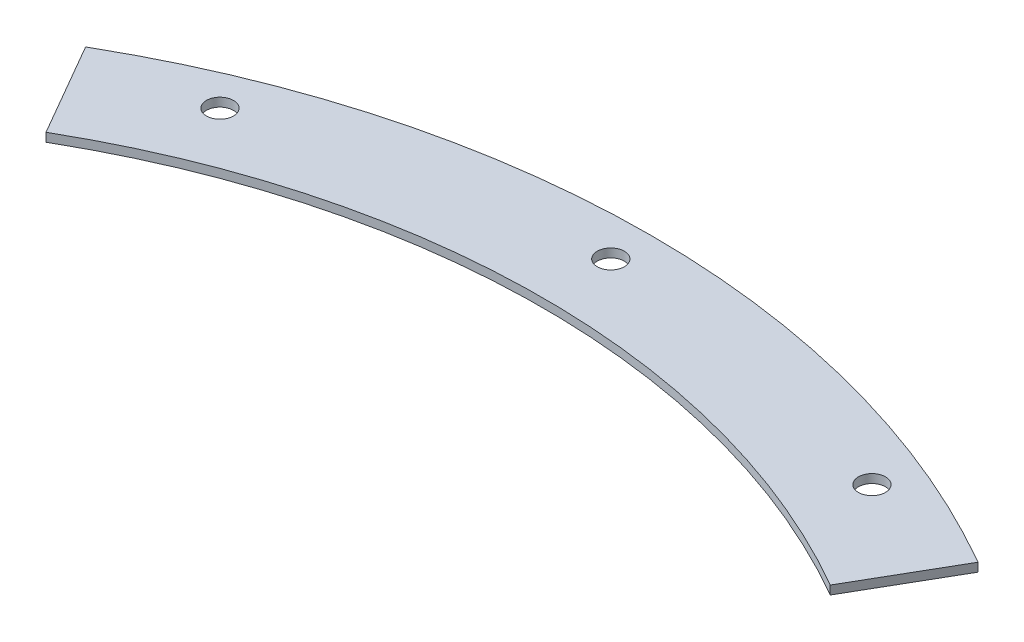
ISO-10303-21;
HEADER;
FILE_DESCRIPTION(('STEP AP214'),'2;1');
FILE_NAME('part.step','',(''),(''),'','','');
FILE_SCHEMA(('AUTOMOTIVE_DESIGN { 1 0 10303 214 1 1 1 1 }'));
ENDSEC;
DATA;
#1=APPLICATION_CONTEXT('core data for automotive mechanical design processes');
#2=APPLICATION_PROTOCOL_DEFINITION('international standard','automotive_design',2000,#1);
#3=PRODUCT_CONTEXT('',#1,'mechanical');
#4=PRODUCT('Part','Part','',(#3));
#5=PRODUCT_RELATED_PRODUCT_CATEGORY('part','',(#4));
#6=PRODUCT_DEFINITION_FORMATION('','',#4);
#7=PRODUCT_DEFINITION_CONTEXT('part definition',#1,'design');
#8=PRODUCT_DEFINITION('design','',#6,#7);
#9=PRODUCT_DEFINITION_SHAPE('','',#8);
#10=(LENGTH_UNIT() NAMED_UNIT(*) SI_UNIT(.MILLI.,.METRE.));
#11=(NAMED_UNIT(*) PLANE_ANGLE_UNIT() SI_UNIT($,.RADIAN.));
#12=(NAMED_UNIT(*) SI_UNIT($,.STERADIAN.) SOLID_ANGLE_UNIT());
#13=UNCERTAINTY_MEASURE_WITH_UNIT(LENGTH_MEASURE(1.E-05),#10,'distance_accuracy_value','');
#14=(GEOMETRIC_REPRESENTATION_CONTEXT(3) GLOBAL_UNCERTAINTY_ASSIGNED_CONTEXT((#13)) GLOBAL_UNIT_ASSIGNED_CONTEXT((#10,
#11,#12)) REPRESENTATION_CONTEXT('',''));
#15=CARTESIAN_POINT('',(0.,0.,0.));
#16=DIRECTION('',(0.,0.,1.));
#17=DIRECTION('',(1.,0.,0.));
#18=AXIS2_PLACEMENT_3D('',#15,#16,#17);
#19=CARTESIAN_POINT('',(0.,1.6,0.));
#20=DIRECTION('',(0.,-1.,0.));
#21=DIRECTION('',(0.,0.,-1.));
#22=AXIS2_PLACEMENT_3D('',#19,#20,#21);
#23=CYLINDRICAL_SURFACE('',#22,145.0000021);
#24=CARTESIAN_POINT('',(0.,0.,0.));
#25=DIRECTION('',(0.,-1.,0.));
#26=DIRECTION('',(0.,0.,-1.));
#27=AXIS2_PLACEMENT_3D('',#24,#25,#26);
#28=CIRCLE('',#27,145.0000021);
#29=CARTESIAN_POINT('',(-72.5000010500002,0.,-125.573685367397));
#30=VERTEX_POINT('',#29);
#31=CARTESIAN_POINT('',(72.5000010500002,0.,-125.573685367397));
#32=VERTEX_POINT('',#31);
#33=EDGE_CURVE('E96',#30,#32,#28,.T.);
#34=ORIENTED_EDGE('',*,*,#33,.T.);
#35=DIRECTION('',(0.,-1.,0.));
#36=VECTOR('',#35,1.);
#37=CARTESIAN_POINT('',(72.5000010500002,1.6,-125.573685367397));
#38=LINE('',#37,#36);
#39=CARTESIAN_POINT('',(72.5000010500002,1.6,-125.573685367397));
#40=VERTEX_POINT('',#39);
#41=EDGE_CURVE('E11',#40,#32,#38,.T.);
#42=ORIENTED_EDGE('',*,*,#41,.F.);
#43=CARTESIAN_POINT('',(0.,1.6,0.));
#44=DIRECTION('',(0.,-1.,0.));
#45=DIRECTION('',(0.,0.,-1.));
#46=AXIS2_PLACEMENT_3D('',#43,#44,#45);
#47=CIRCLE('',#46,145.0000021);
#48=CARTESIAN_POINT('',(-72.5000010500002,1.6,-125.573685367397));
#49=VERTEX_POINT('',#48);
#50=EDGE_CURVE('E84',#49,#40,#47,.T.);
#51=ORIENTED_EDGE('',*,*,#50,.F.);
#52=DIRECTION('',(0.,-1.,0.));
#53=VECTOR('',#52,1.);
#54=CARTESIAN_POINT('',(-72.5000010500002,1.6,-125.573685367397));
#55=LINE('',#54,#53);
#56=EDGE_CURVE('E92',#49,#30,#55,.T.);
#57=ORIENTED_EDGE('',*,*,#56,.T.);
#58=EDGE_LOOP('',(#34,#42,#51,#57));
#59=FACE_BOUND('',#58,.T.);
#60=ADVANCED_FACE('F33',(#59),#23,.F.);
#61=CARTESIAN_POINT('',(72.5000010500002,1.6,-125.573685367397));
#62=DIRECTION('',(-0.866025403784437,0.,-0.500000000000003));
#63=DIRECTION('',(-0.500000000000003,0.,0.866025403784437));
#64=AXIS2_PLACEMENT_3D('',#61,#62,#63);
#65=PLANE('',#64);
#66=DIRECTION('',(0.500000000000003,0.,-0.866025403784437));
#67=VECTOR('',#66,1.);
#68=CARTESIAN_POINT('',(72.5000010500002,0.,-125.573685367397));
#69=LINE('',#68,#67);
#70=CARTESIAN_POINT('',(82.5000010500002,0.,-142.894193443086));
#71=VERTEX_POINT('',#70);
#72=EDGE_CURVE('E88',#32,#71,#69,.T.);
#73=ORIENTED_EDGE('',*,*,#72,.T.);
#74=DIRECTION('',(0.,-1.,0.));
#75=VECTOR('',#74,1.);
#76=CARTESIAN_POINT('',(82.5000010500002,1.6,-142.894193443086));
#77=LINE('',#76,#75);
#78=CARTESIAN_POINT('',(82.5000010500002,1.6,-142.894193443086));
#79=VERTEX_POINT('',#78);
#80=EDGE_CURVE('E41',#79,#71,#77,.T.);
#81=ORIENTED_EDGE('',*,*,#80,.F.);
#82=DIRECTION('',(0.500000000000003,0.,-0.866025403784437));
#83=VECTOR('',#82,1.);
#84=CARTESIAN_POINT('',(72.5000010500002,1.6,-125.573685367397));
#85=LINE('',#84,#83);
#86=EDGE_CURVE('E79',#40,#79,#85,.T.);
#87=ORIENTED_EDGE('',*,*,#86,.F.);
#88=ORIENTED_EDGE('',*,*,#41,.T.);
#89=EDGE_LOOP('',(#73,#81,#87,#88));
#90=FACE_BOUND('',#89,.T.);
#91=ADVANCED_FACE('F87',(#90),#65,.F.);
#92=CARTESIAN_POINT('',(0.,1.6,0.));
#93=DIRECTION('',(0.,-1.,0.));
#94=DIRECTION('',(0.,0.,-1.));
#95=AXIS2_PLACEMENT_3D('',#92,#93,#94);
#96=CYLINDRICAL_SURFACE('',#95,165.0000021);
#97=CARTESIAN_POINT('',(0.,0.,0.));
#98=DIRECTION('',(0.,1.,0.));
#99=DIRECTION('',(0.,0.,-1.));
#100=AXIS2_PLACEMENT_3D('',#97,#98,#99);
#101=CIRCLE('',#100,165.0000021);
#102=CARTESIAN_POINT('',(-82.5000010500002,0.,-142.894193443086));
#103=VERTEX_POINT('',#102);
#104=EDGE_CURVE('E66',#71,#103,#101,.T.);
#105=ORIENTED_EDGE('',*,*,#104,.T.);
#106=DIRECTION('',(0.,-1.,0.));
#107=VECTOR('',#106,1.);
#108=CARTESIAN_POINT('',(-82.5000010500002,1.6,-142.894193443086));
#109=LINE('',#108,#107);
#110=CARTESIAN_POINT('',(-82.5000010500002,1.6,-142.894193443086));
#111=VERTEX_POINT('',#110);
#112=EDGE_CURVE('E89',#111,#103,#109,.T.);
#113=ORIENTED_EDGE('',*,*,#112,.F.);
#114=CARTESIAN_POINT('',(0.,1.6,0.));
#115=DIRECTION('',(0.,1.,0.));
#116=DIRECTION('',(0.,0.,-1.));
#117=AXIS2_PLACEMENT_3D('',#114,#115,#116);
#118=CIRCLE('',#117,165.0000021);
#119=EDGE_CURVE('E82',#79,#111,#118,.T.);
#120=ORIENTED_EDGE('',*,*,#119,.F.);
#121=ORIENTED_EDGE('',*,*,#80,.T.);
#122=EDGE_LOOP('',(#105,#113,#120,#121));
#123=FACE_BOUND('',#122,.T.);
#124=ADVANCED_FACE('F90',(#123),#96,.T.);
#125=CARTESIAN_POINT('',(-72.5000010500002,1.6,-125.573685367397));
#126=DIRECTION('',(0.866025403784437,0.,-0.500000000000003));
#127=DIRECTION('',(-0.500000000000003,0.,-0.866025403784437));
#128=AXIS2_PLACEMENT_3D('',#125,#126,#127);
#129=PLANE('',#128);
#130=DIRECTION('',(0.500000000000003,0.,0.866025403784437));
#131=VECTOR('',#130,1.);
#132=CARTESIAN_POINT('',(-72.5000010500002,0.,-125.573685367397));
#133=LINE('',#132,#131);
#134=EDGE_CURVE('E72',#103,#30,#133,.T.);
#135=ORIENTED_EDGE('',*,*,#134,.T.);
#136=ORIENTED_EDGE('',*,*,#56,.F.);
#137=DIRECTION('',(0.500000000000003,0.,0.866025403784437));
#138=VECTOR('',#137,1.);
#139=CARTESIAN_POINT('',(-72.5000010500002,1.6,-125.573685367397));
#140=LINE('',#139,#138);
#141=EDGE_CURVE('E49',#111,#49,#140,.T.);
#142=ORIENTED_EDGE('',*,*,#141,.F.);
#143=ORIENTED_EDGE('',*,*,#112,.T.);
#144=EDGE_LOOP('',(#135,#136,#142,#143));
#145=FACE_BOUND('',#144,.T.);
#146=ADVANCED_FACE('F104',(#145),#129,.F.);
#147=CARTESIAN_POINT('',(0.,1.6,0.));
#148=DIRECTION('',(0.,-1.,0.));
#149=DIRECTION('',(0.,0.,-1.));
#150=AXIS2_PLACEMENT_3D('',#147,#148,#149);
#151=PLANE('',#150);
#152=CARTESIAN_POINT('',(0.,1.6,-157.5));
#153=DIRECTION('',(0.,-1.,0.));
#154=DIRECTION('',(0.,0.,-1.));
#155=AXIS2_PLACEMENT_3D('',#152,#153,#154);
#156=CIRCLE('',#155,2.5);
#157=CARTESIAN_POINT('',(0.,1.6,-160.));
#158=VERTEX_POINT('',#157);
#159=EDGE_CURVE('E115',#158,#158,#156,.T.);
#160=ORIENTED_EDGE('',*,*,#159,.T.);
#161=EDGE_LOOP('',(#160));
#162=FACE_BOUND('',#161,.T.);
#163=CARTESIAN_POINT('',(60.2726405975008,1.6,-145.511026370528));
#164=DIRECTION('',(0.,-1.,0.));
#165=DIRECTION('',(0.,0.,-1.));
#166=AXIS2_PLACEMENT_3D('',#163,#164,#165);
#167=CIRCLE('',#166,2.5);
#168=CARTESIAN_POINT('',(60.2726405975008,1.6,-148.011026370528));
#169=VERTEX_POINT('',#168);
#170=EDGE_CURVE('E118',#169,#169,#167,.T.);
#171=ORIENTED_EDGE('',*,*,#170,.T.);
#172=EDGE_LOOP('',(#171));
#173=FACE_BOUND('',#172,.T.);
#174=CARTESIAN_POINT('',(-60.2726405975007,1.6,-145.511026370528));
#175=DIRECTION('',(0.,-1.,0.));
#176=DIRECTION('',(0.,0.,-1.));
#177=AXIS2_PLACEMENT_3D('',#174,#175,#176);
#178=CIRCLE('',#177,2.5);
#179=CARTESIAN_POINT('',(-60.2726405975007,1.6,-148.011026370528));
#180=VERTEX_POINT('',#179);
#181=EDGE_CURVE('E99',#180,#180,#178,.T.);
#182=ORIENTED_EDGE('',*,*,#181,.T.);
#183=EDGE_LOOP('',(#182));
#184=FACE_BOUND('',#183,.T.);
#185=ORIENTED_EDGE('',*,*,#50,.T.);
#186=ORIENTED_EDGE('',*,*,#86,.T.);
#187=ORIENTED_EDGE('',*,*,#119,.T.);
#188=ORIENTED_EDGE('',*,*,#141,.T.);
#189=EDGE_LOOP('',(#185,#186,#187,#188));
#190=FACE_BOUND('',#189,.T.);
#191=ADVANCED_FACE('F80',(#162,#173,#184,#190),#151,.F.);
#192=CARTESIAN_POINT('',(0.,0.,0.));
#193=DIRECTION('',(0.,-1.,0.));
#194=DIRECTION('',(0.,0.,-1.));
#195=AXIS2_PLACEMENT_3D('',#192,#193,#194);
#196=PLANE('',#195);
#197=CARTESIAN_POINT('',(0.,0.,-157.5));
#198=DIRECTION('',(0.,-1.,0.));
#199=DIRECTION('',(0.,0.,-1.));
#200=AXIS2_PLACEMENT_3D('',#197,#198,#199);
#201=CIRCLE('',#200,2.5);
#202=CARTESIAN_POINT('',(0.,0.,-160.));
#203=VERTEX_POINT('',#202);
#204=EDGE_CURVE('E121',#203,#203,#201,.T.);
#205=ORIENTED_EDGE('',*,*,#204,.F.);
#206=EDGE_LOOP('',(#205));
#207=FACE_BOUND('',#206,.T.);
#208=CARTESIAN_POINT('',(60.2726405975008,0.,-145.511026370528));
#209=DIRECTION('',(0.,-1.,0.));
#210=DIRECTION('',(0.,0.,-1.));
#211=AXIS2_PLACEMENT_3D('',#208,#209,#210);
#212=CIRCLE('',#211,2.5);
#213=CARTESIAN_POINT('',(60.2726405975008,0.,-148.011026370528));
#214=VERTEX_POINT('',#213);
#215=EDGE_CURVE('E122',#214,#214,#212,.T.);
#216=ORIENTED_EDGE('',*,*,#215,.F.);
#217=EDGE_LOOP('',(#216));
#218=FACE_BOUND('',#217,.T.);
#219=CARTESIAN_POINT('',(-60.2726405975007,0.,-145.511026370528));
#220=DIRECTION('',(0.,-1.,0.));
#221=DIRECTION('',(0.,0.,-1.));
#222=AXIS2_PLACEMENT_3D('',#219,#220,#221);
#223=CIRCLE('',#222,2.5);
#224=CARTESIAN_POINT('',(-60.2726405975007,0.,-148.011026370528));
#225=VERTEX_POINT('',#224);
#226=EDGE_CURVE('E112',#225,#225,#223,.T.);
#227=ORIENTED_EDGE('',*,*,#226,.F.);
#228=EDGE_LOOP('',(#227));
#229=FACE_BOUND('',#228,.T.);
#230=ORIENTED_EDGE('',*,*,#33,.F.);
#231=ORIENTED_EDGE('',*,*,#134,.F.);
#232=ORIENTED_EDGE('',*,*,#104,.F.);
#233=ORIENTED_EDGE('',*,*,#72,.F.);
#234=EDGE_LOOP('',(#230,#231,#232,#233));
#235=FACE_BOUND('',#234,.T.);
#236=ADVANCED_FACE('F107',(#207,#218,#229,#235),#196,.T.);
#237=CARTESIAN_POINT('',(-60.2726405975007,10.,-145.511026370528));
#238=DIRECTION('',(0.,-1.,0.));
#239=DIRECTION('',(0.,0.,-1.));
#240=AXIS2_PLACEMENT_3D('',#237,#238,#239);
#241=CYLINDRICAL_SURFACE('',#240,2.5);
#242=ORIENTED_EDGE('',*,*,#226,.T.);
#243=EDGE_LOOP('',(#242));
#244=FACE_BOUND('',#243,.T.);
#245=ORIENTED_EDGE('',*,*,#181,.F.);
#246=EDGE_LOOP('',(#245));
#247=FACE_BOUND('',#246,.T.);
#248=ADVANCED_FACE('F133',(#244,#247),#241,.F.);
#249=CARTESIAN_POINT('',(60.2726405975008,10.,-145.511026370528));
#250=DIRECTION('',(0.,-1.,0.));
#251=DIRECTION('',(0.,0.,-1.));
#252=AXIS2_PLACEMENT_3D('',#249,#250,#251);
#253=CYLINDRICAL_SURFACE('',#252,2.5);
#254=ORIENTED_EDGE('',*,*,#215,.T.);
#255=EDGE_LOOP('',(#254));
#256=FACE_BOUND('',#255,.T.);
#257=ORIENTED_EDGE('',*,*,#170,.F.);
#258=EDGE_LOOP('',(#257));
#259=FACE_BOUND('',#258,.T.);
#260=ADVANCED_FACE('F141',(#256,#259),#253,.F.);
#261=CARTESIAN_POINT('',(0.,10.,-157.5));
#262=DIRECTION('',(0.,-1.,0.));
#263=DIRECTION('',(0.,0.,-1.));
#264=AXIS2_PLACEMENT_3D('',#261,#262,#263);
#265=CYLINDRICAL_SURFACE('',#264,2.5);
#266=ORIENTED_EDGE('',*,*,#204,.T.);
#267=EDGE_LOOP('',(#266));
#268=FACE_BOUND('',#267,.T.);
#269=ORIENTED_EDGE('',*,*,#159,.F.);
#270=EDGE_LOOP('',(#269));
#271=FACE_BOUND('',#270,.T.);
#272=ADVANCED_FACE('F128',(#268,#271),#265,.F.);
#273=CLOSED_SHELL('',(#60,#91,#124,#146,#191,#236,#248,#260,#272));
#274=MANIFOLD_SOLID_BREP('B2',#273);
#275=ADVANCED_BREP_SHAPE_REPRESENTATION('',(#18,#274),#14);
#276=SHAPE_DEFINITION_REPRESENTATION(#9,#275);
ENDSEC;
END-ISO-10303-21;
